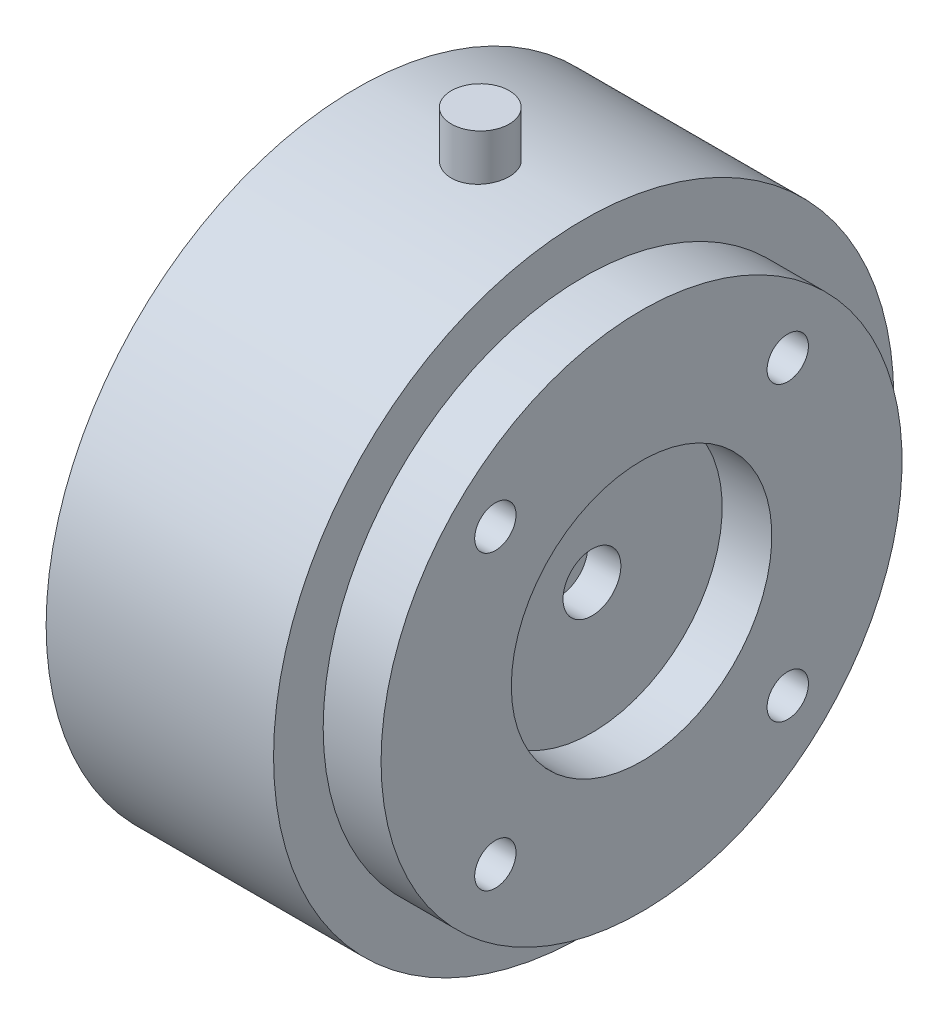
ISO-10303-21;
HEADER;
FILE_DESCRIPTION(('STEP AP214'),'2;1');
FILE_NAME('part.step','',(''),(''),'','','');
FILE_SCHEMA(('AUTOMOTIVE_DESIGN { 1 0 10303 214 1 1 1 1 }'));
ENDSEC;
DATA;
#1=APPLICATION_CONTEXT('core data for automotive mechanical design processes');
#2=APPLICATION_PROTOCOL_DEFINITION('international standard','automotive_design',2000,#1);
#3=PRODUCT_CONTEXT('',#1,'mechanical');
#4=PRODUCT('Part','Part','',(#3));
#5=PRODUCT_RELATED_PRODUCT_CATEGORY('part','',(#4));
#6=PRODUCT_DEFINITION_FORMATION('','',#4);
#7=PRODUCT_DEFINITION_CONTEXT('part definition',#1,'design');
#8=PRODUCT_DEFINITION('design','',#6,#7);
#9=PRODUCT_DEFINITION_SHAPE('','',#8);
#10=(LENGTH_UNIT() NAMED_UNIT(*) SI_UNIT(.MILLI.,.METRE.));
#11=(NAMED_UNIT(*) PLANE_ANGLE_UNIT() SI_UNIT($,.RADIAN.));
#12=(NAMED_UNIT(*) SI_UNIT($,.STERADIAN.) SOLID_ANGLE_UNIT());
#13=UNCERTAINTY_MEASURE_WITH_UNIT(LENGTH_MEASURE(1.E-05),#10,'distance_accuracy_value','');
#14=(GEOMETRIC_REPRESENTATION_CONTEXT(3) GLOBAL_UNCERTAINTY_ASSIGNED_CONTEXT((#13)) GLOBAL_UNIT_ASSIGNED_CONTEXT((#10,
#11,#12)) REPRESENTATION_CONTEXT('',''));
#15=CARTESIAN_POINT('',(0.,0.,0.));
#16=DIRECTION('',(0.,0.,1.));
#17=DIRECTION('',(1.,0.,0.));
#18=AXIS2_PLACEMENT_3D('',#15,#16,#17);
#19=CARTESIAN_POINT('',(24.5000000000001,0.,0.));
#20=DIRECTION('',(1.,0.,0.));
#21=DIRECTION('',(0.,0.,-1.));
#22=AXIS2_PLACEMENT_3D('',#19,#20,#21);
#23=PLANE('',#22);
#24=CARTESIAN_POINT('',(24.5000000000001,0.,0.));
#25=DIRECTION('',(1.,0.,0.));
#26=DIRECTION('',(0.,0.,-1.));
#27=AXIS2_PLACEMENT_3D('',#24,#25,#26);
#28=CIRCLE('',#27,3.5);
#29=CARTESIAN_POINT('',(24.5000000000001,0.,-3.50000000000006));
#30=VERTEX_POINT('',#29);
#31=EDGE_CURVE('P0_E19',#30,#30,#28,.T.);
#32=ORIENTED_EDGE('',*,*,#31,.T.);
#33=EDGE_LOOP('',(#32));
#34=FACE_BOUND('',#33,.T.);
#35=ADVANCED_FACE('P0_F16',(#34),#23,.T.);
#36=CARTESIAN_POINT('',(0.,0.,0.));
#37=DIRECTION('',(1.,0.,0.));
#38=DIRECTION('',(0.,0.,-1.));
#39=AXIS2_PLACEMENT_3D('',#36,#37,#38);
#40=CYLINDRICAL_SURFACE('',#39,3.5);
#41=CARTESIAN_POINT('',(28.5,-1.11022302462516E-13,0.));
#42=DIRECTION('',(1.,0.,0.));
#43=DIRECTION('',(0.,0.,-1.));
#44=AXIS2_PLACEMENT_3D('',#41,#42,#43);
#45=CIRCLE('',#44,3.5);
#46=CARTESIAN_POINT('',(28.5,-1.10050857315969E-13,-3.50000000000006));
#47=VERTEX_POINT('',#46);
#48=EDGE_CURVE('P0_E49',#47,#47,#45,.T.);
#49=ORIENTED_EDGE('',*,*,#48,.T.);
#50=EDGE_LOOP('',(#49));
#51=FACE_BOUND('',#50,.T.);
#52=ORIENTED_EDGE('',*,*,#31,.F.);
#53=EDGE_LOOP('',(#52));
#54=FACE_BOUND('',#53,.T.);
#55=ADVANCED_FACE('P0_F42',(#51,#54),#40,.F.);
#56=CARTESIAN_POINT('',(26.4999999999418,-17.6776695296639,17.6776695296636));
#57=DIRECTION('',(1.,0.,0.));
#58=DIRECTION('',(0.,0.,-1.));
#59=AXIS2_PLACEMENT_3D('',#56,#57,#58);
#60=CONICAL_SURFACE('',#59,2.49999999997192,1.02974425861597);
#61=CARTESIAN_POINT('',(24.9978484523581,-17.6776695296639,17.6776695297463));
#62=VERTEX_POINT('',#61);
#63=VERTEX_LOOP('',#62);
#64=FACE_BOUND('',#63,.T.);
#65=CARTESIAN_POINT('',(26.5,-17.6776695296639,17.6776695296635));
#66=DIRECTION('',(1.,0.,0.));
#67=DIRECTION('',(0.,0.,-1.));
#68=AXIS2_PLACEMENT_3D('',#65,#66,#67);
#69=CIRCLE('',#68,2.5);
#70=CARTESIAN_POINT('',(26.5,-17.6776695296639,15.1776695296635));
#71=VERTEX_POINT('',#70);
#72=EDGE_CURVE('P0_E46',#71,#71,#69,.T.);
#73=ORIENTED_EDGE('',*,*,#72,.T.);
#74=EDGE_LOOP('',(#73));
#75=FACE_BOUND('',#74,.T.);
#76=ADVANCED_FACE('P0_F38',(#64,#75),#60,.F.);
#77=CARTESIAN_POINT('',(26.4999999999418,17.6776695296637,17.6776695296638));
#78=DIRECTION('',(1.,0.,0.));
#79=DIRECTION('',(0.,0.,-1.));
#80=AXIS2_PLACEMENT_3D('',#77,#78,#79);
#81=CONICAL_SURFACE('',#80,2.49999999997201,1.029744258616);
#82=CARTESIAN_POINT('',(24.9978484523581,17.6776695296637,17.6776695297463));
#83=VERTEX_POINT('',#82);
#84=VERTEX_LOOP('',#83);
#85=FACE_BOUND('',#84,.T.);
#86=CARTESIAN_POINT('',(26.5,17.6776695296637,17.6776695296638));
#87=DIRECTION('',(1.,0.,0.));
#88=DIRECTION('',(0.,0.,-1.));
#89=AXIS2_PLACEMENT_3D('',#86,#87,#88);
#90=CIRCLE('',#89,2.5);
#91=CARTESIAN_POINT('',(26.5,17.6776695296637,15.1776695296638));
#92=VERTEX_POINT('',#91);
#93=EDGE_CURVE('P0_E48',#92,#92,#90,.T.);
#94=ORIENTED_EDGE('',*,*,#93,.T.);
#95=EDGE_LOOP('',(#94));
#96=FACE_BOUND('',#95,.T.);
#97=ADVANCED_FACE('P0_F41',(#85,#96),#81,.F.);
#98=CARTESIAN_POINT('',(26.4999999999987,17.6776695296637,-17.6776695296637));
#99=DIRECTION('',(1.,0.,0.));
#100=DIRECTION('',(0.,1.,0.));
#101=AXIS2_PLACEMENT_3D('',#98,#99,#100);
#102=CONICAL_SURFACE('',#101,2.50000000002344,1.0297442586442);
#103=CARTESIAN_POINT('',(24.9978484524149,17.6776695296637,-17.6776695296326));
#104=VERTEX_POINT('',#103);
#105=VERTEX_LOOP('',#104);
#106=FACE_BOUND('',#105,.T.);
#107=CARTESIAN_POINT('',(26.5000000000001,17.6776695296637,-17.6776695296637));
#108=DIRECTION('',(1.,0.,0.));
#109=DIRECTION('',(0.,0.,-1.));
#110=AXIS2_PLACEMENT_3D('',#107,#108,#109);
#111=CIRCLE('',#110,2.5);
#112=CARTESIAN_POINT('',(26.5000000000001,17.6776695296637,-20.1776695296637));
#113=VERTEX_POINT('',#112);
#114=EDGE_CURVE('P0_E52',#113,#113,#111,.T.);
#115=ORIENTED_EDGE('',*,*,#114,.T.);
#116=EDGE_LOOP('',(#115));
#117=FACE_BOUND('',#116,.T.);
#118=ADVANCED_FACE('P0_F140',(#106,#117),#102,.F.);
#119=CARTESIAN_POINT('',(26.4999999999985,-17.6776695296634,-17.6776695296638));
#120=DIRECTION('',(1.,0.,0.));
#121=DIRECTION('',(0.,1.,0.));
#122=AXIS2_PLACEMENT_3D('',#119,#120,#121);
#123=CONICAL_SURFACE('',#122,2.50000000002334,1.02974425864416);
#124=CARTESIAN_POINT('',(24.997848452415,-17.6776695296634,-17.6776695296326));
#125=VERTEX_POINT('',#124);
#126=VERTEX_LOOP('',#125);
#127=FACE_BOUND('',#126,.T.);
#128=CARTESIAN_POINT('',(26.4999999999999,-17.6776695296634,-17.6776695296639));
#129=DIRECTION('',(1.,0.,0.));
#130=DIRECTION('',(0.,0.,-1.));
#131=AXIS2_PLACEMENT_3D('',#128,#129,#130);
#132=CIRCLE('',#131,2.5);
#133=CARTESIAN_POINT('',(26.4999999999999,-17.6776695296634,-20.1776695296639));
#134=VERTEX_POINT('',#133);
#135=EDGE_CURVE('P0_E160',#134,#134,#132,.T.);
#136=ORIENTED_EDGE('',*,*,#135,.T.);
#137=EDGE_LOOP('',(#136));
#138=FACE_BOUND('',#137,.T.);
#139=ADVANCED_FACE('P0_F136',(#127,#138),#123,.F.);
#140=CARTESIAN_POINT('',(28.5,15.75,0.));
#141=DIRECTION('',(-1.,0.,0.));
#142=DIRECTION('',(0.,0.,1.));
#143=AXIS2_PLACEMENT_3D('',#140,#141,#142);
#144=PLANE('',#143);
#145=ORIENTED_EDGE('',*,*,#48,.F.);
#146=EDGE_LOOP('',(#145));
#147=FACE_BOUND('',#146,.T.);
#148=CARTESIAN_POINT('',(28.5,-1.11022302462516E-13,0.));
#149=DIRECTION('',(-1.,0.,0.));
#150=DIRECTION('',(0.,0.,1.));
#151=AXIS2_PLACEMENT_3D('',#148,#149,#150);
#152=CIRCLE('',#151,15.75);
#153=CARTESIAN_POINT('',(28.5,-1.15393805621977E-13,15.7499999999999));
#154=VERTEX_POINT('',#153);
#155=EDGE_CURVE('P0_E158',#154,#154,#152,.F.);
#156=ORIENTED_EDGE('',*,*,#155,.T.);
#157=EDGE_LOOP('',(#156));
#158=FACE_BOUND('',#157,.T.);
#159=ADVANCED_FACE('P0_F132',(#147,#158),#144,.F.);
#160=CARTESIAN_POINT('',(34.5000000000001,-17.6776695296638,17.6776695296635));
#161=DIRECTION('',(1.,0.,0.));
#162=DIRECTION('',(0.,0.,-1.));
#163=AXIS2_PLACEMENT_3D('',#160,#161,#162);
#164=CYLINDRICAL_SURFACE('',#163,2.5);
#165=CARTESIAN_POINT('',(34.5000000000001,-17.6776695296638,17.6776695296635));
#166=DIRECTION('',(1.,0.,0.));
#167=DIRECTION('',(0.,0.,-1.));
#168=AXIS2_PLACEMENT_3D('',#165,#166,#167);
#169=CIRCLE('',#168,2.5);
#170=CARTESIAN_POINT('',(34.5000000000001,-17.6776695296638,15.1776695296635));
#171=VERTEX_POINT('',#170);
#172=EDGE_CURVE('P0_E159',#171,#171,#169,.T.);
#173=ORIENTED_EDGE('',*,*,#172,.T.);
#174=EDGE_LOOP('',(#173));
#175=FACE_BOUND('',#174,.T.);
#176=ORIENTED_EDGE('',*,*,#72,.F.);
#177=EDGE_LOOP('',(#176));
#178=FACE_BOUND('',#177,.T.);
#179=ADVANCED_FACE('P0_F128',(#175,#178),#164,.F.);
#180=CARTESIAN_POINT('',(34.5,17.6776695296637,17.6776695296636));
#181=DIRECTION('',(1.,0.,0.));
#182=DIRECTION('',(0.,0.,-1.));
#183=AXIS2_PLACEMENT_3D('',#180,#181,#182);
#184=CYLINDRICAL_SURFACE('',#183,2.5);
#185=CARTESIAN_POINT('',(34.5,17.6776695296637,17.6776695296636));
#186=DIRECTION('',(1.,0.,0.));
#187=DIRECTION('',(0.,0.,-1.));
#188=AXIS2_PLACEMENT_3D('',#185,#186,#187);
#189=CIRCLE('',#188,2.5);
#190=CARTESIAN_POINT('',(34.5,17.6776695296637,15.1776695296636));
#191=VERTEX_POINT('',#190);
#192=EDGE_CURVE('P0_E163',#191,#191,#189,.T.);
#193=ORIENTED_EDGE('',*,*,#192,.T.);
#194=EDGE_LOOP('',(#193));
#195=FACE_BOUND('',#194,.T.);
#196=ORIENTED_EDGE('',*,*,#93,.F.);
#197=EDGE_LOOP('',(#196));
#198=FACE_BOUND('',#197,.T.);
#199=ADVANCED_FACE('P0_F124',(#195,#198),#184,.F.);
#200=CARTESIAN_POINT('',(34.5,17.6776695296638,-17.6776695296637));
#201=DIRECTION('',(1.,0.,0.));
#202=DIRECTION('',(0.,0.,-1.));
#203=AXIS2_PLACEMENT_3D('',#200,#201,#202);
#204=CYLINDRICAL_SURFACE('',#203,2.5);
#205=CARTESIAN_POINT('',(34.5,17.6776695296638,-17.6776695296637));
#206=DIRECTION('',(1.,0.,0.));
#207=DIRECTION('',(0.,0.,-1.));
#208=AXIS2_PLACEMENT_3D('',#205,#206,#207);
#209=CIRCLE('',#208,2.5);
#210=CARTESIAN_POINT('',(34.5,17.6776695296638,-20.1776695296637));
#211=VERTEX_POINT('',#210);
#212=EDGE_CURVE('P0_E170',#211,#211,#209,.T.);
#213=ORIENTED_EDGE('',*,*,#212,.T.);
#214=EDGE_LOOP('',(#213));
#215=FACE_BOUND('',#214,.T.);
#216=ORIENTED_EDGE('',*,*,#114,.F.);
#217=EDGE_LOOP('',(#216));
#218=FACE_BOUND('',#217,.T.);
#219=ADVANCED_FACE('P0_F120',(#215,#218),#204,.F.);
#220=CARTESIAN_POINT('',(34.5,-17.6776695296637,-17.6776695296638));
#221=DIRECTION('',(1.,0.,0.));
#222=DIRECTION('',(0.,0.,-1.));
#223=AXIS2_PLACEMENT_3D('',#220,#221,#222);
#224=CYLINDRICAL_SURFACE('',#223,2.5);
#225=CARTESIAN_POINT('',(34.5,-17.6776695296637,-17.6776695296638));
#226=DIRECTION('',(1.,0.,0.));
#227=DIRECTION('',(0.,0.,-1.));
#228=AXIS2_PLACEMENT_3D('',#225,#226,#227);
#229=CIRCLE('',#228,2.5);
#230=CARTESIAN_POINT('',(34.5,-17.6776695296637,-20.1776695296638));
#231=VERTEX_POINT('',#230);
#232=EDGE_CURVE('P0_E173',#231,#231,#229,.T.);
#233=ORIENTED_EDGE('',*,*,#232,.T.);
#234=EDGE_LOOP('',(#233));
#235=FACE_BOUND('',#234,.T.);
#236=ORIENTED_EDGE('',*,*,#135,.F.);
#237=EDGE_LOOP('',(#236));
#238=FACE_BOUND('',#237,.T.);
#239=ADVANCED_FACE('P0_F116',(#235,#238),#224,.F.);
#240=CARTESIAN_POINT('',(0.,0.,0.));
#241=DIRECTION('',(-1.,0.,0.));
#242=DIRECTION('',(0.,0.,1.));
#243=AXIS2_PLACEMENT_3D('',#240,#241,#242);
#244=CYLINDRICAL_SURFACE('',#243,15.75);
#245=ORIENTED_EDGE('',*,*,#155,.F.);
#246=EDGE_LOOP('',(#245));
#247=FACE_BOUND('',#246,.T.);
#248=CARTESIAN_POINT('',(34.5,0.,1.11022302462516E-13));
#249=DIRECTION('',(-1.,0.,0.));
#250=DIRECTION('',(0.,0.,1.));
#251=AXIS2_PLACEMENT_3D('',#248,#249,#250);
#252=CIRCLE('',#251,15.75);
#253=CARTESIAN_POINT('',(34.5,0.,15.7500000000001));
#254=VERTEX_POINT('',#253);
#255=EDGE_CURVE('P0_E176',#254,#254,#252,.F.);
#256=ORIENTED_EDGE('',*,*,#255,.T.);
#257=EDGE_LOOP('',(#256));
#258=FACE_BOUND('',#257,.T.);
#259=ADVANCED_FACE('P0_F112',(#247,#258),#244,.F.);
#260=CARTESIAN_POINT('',(34.5000000000001,31.5,0.));
#261=DIRECTION('',(-1.,0.,0.));
#262=DIRECTION('',(0.,0.,1.));
#263=AXIS2_PLACEMENT_3D('',#260,#261,#262);
#264=PLANE('',#263);
#265=ORIENTED_EDGE('',*,*,#255,.F.);
#266=EDGE_LOOP('',(#265));
#267=FACE_BOUND('',#266,.T.);
#268=ORIENTED_EDGE('',*,*,#232,.F.);
#269=EDGE_LOOP('',(#268));
#270=FACE_BOUND('',#269,.T.);
#271=ORIENTED_EDGE('',*,*,#212,.F.);
#272=EDGE_LOOP('',(#271));
#273=FACE_BOUND('',#272,.T.);
#274=ORIENTED_EDGE('',*,*,#192,.F.);
#275=EDGE_LOOP('',(#274));
#276=FACE_BOUND('',#275,.T.);
#277=ORIENTED_EDGE('',*,*,#172,.F.);
#278=EDGE_LOOP('',(#277));
#279=FACE_BOUND('',#278,.T.);
#280=CARTESIAN_POINT('',(34.5,0.,1.11022302462516E-13));
#281=DIRECTION('',(-1.,0.,0.));
#282=DIRECTION('',(0.,0.,1.));
#283=AXIS2_PLACEMENT_3D('',#280,#281,#282);
#284=CIRCLE('',#283,31.5);
#285=CARTESIAN_POINT('',(34.5,0.,31.5000000000001));
#286=VERTEX_POINT('',#285);
#287=EDGE_CURVE('P0_E178',#286,#286,#284,.T.);
#288=ORIENTED_EDGE('',*,*,#287,.F.);
#289=EDGE_LOOP('',(#288));
#290=FACE_BOUND('',#289,.T.);
#291=ADVANCED_FACE('P0_F108',(#267,#270,#273,#276,#279,#290),#264,.F.);
#292=CARTESIAN_POINT('',(0.,0.,0.));
#293=DIRECTION('',(-1.,0.,0.));
#294=DIRECTION('',(0.,0.,1.));
#295=AXIS2_PLACEMENT_3D('',#292,#293,#294);
#296=CYLINDRICAL_SURFACE('',#295,31.5);
#297=CARTESIAN_POINT('',(27.4999999999999,0.,0.));
#298=DIRECTION('',(-1.,0.,0.));
#299=DIRECTION('',(0.,0.,1.));
#300=AXIS2_PLACEMENT_3D('',#297,#298,#299);
#301=CIRCLE('',#300,31.5);
#302=CARTESIAN_POINT('',(27.4999999999999,0.,31.5));
#303=VERTEX_POINT('',#302);
#304=EDGE_CURVE('P0_E90',#303,#303,#301,.F.);
#305=ORIENTED_EDGE('',*,*,#304,.T.);
#306=EDGE_LOOP('',(#305));
#307=FACE_BOUND('',#306,.T.);
#308=ORIENTED_EDGE('',*,*,#287,.T.);
#309=EDGE_LOOP('',(#308));
#310=FACE_BOUND('',#309,.T.);
#311=ADVANCED_FACE('P0_F104',(#307,#310),#296,.T.);
#312=CARTESIAN_POINT('',(110.767027304759,0.,0.));
#313=DIRECTION('',(-1.,0.,0.));
#314=DIRECTION('',(0.,0.,1.));
#315=AXIS2_PLACEMENT_3D('',#312,#313,#314);
#316=CYLINDRICAL_SURFACE('',#315,30.5);
#317=CARTESIAN_POINT('',(14.9999999999999,30.2985148150862,3.5));
#318=CARTESIAN_POINT('',(15.1957241918326,30.2985173782008,3.4999914572695));
#319=CARTESIAN_POINT('',(15.391706129943,30.3004332540409,3.48351415691749));
#320=CARTESIAN_POINT('',(15.7783592301681,30.3078916885357,3.41800360986971));
#321=CARTESIAN_POINT('',(15.9690184270781,30.313441824264,3.36890234227045));
#322=CARTESIAN_POINT('',(16.3391717964098,30.3275322944482,3.23959657868737));
#323=CARTESIAN_POINT('',(16.5186773197242,30.3360695282893,3.15942432520612));
#324=CARTESIAN_POINT('',(16.8616010791099,30.3551677477308,2.97031612135546));
#325=CARTESIAN_POINT('',(17.0250261007646,30.3657278741279,2.86139237549712));
#326=CARTESIAN_POINT('',(17.3320316611393,30.3877407639859,2.61729800992376));
#327=CARTESIAN_POINT('',(17.4755233500653,30.3991971892655,2.48201595110771));
#328=CARTESIAN_POINT('',(17.737825696396,30.4216792291987,2.18927848624546));
#329=CARTESIAN_POINT('',(17.8566339511489,30.4327048018289,2.03182092416667));
#330=CARTESIAN_POINT('',(18.066493529691,30.4531181691266,1.69866981088559));
#331=CARTESIAN_POINT('',(18.1574674419036,30.4625013656716,1.5229271905094));
#332=CARTESIAN_POINT('',(18.3085792035096,30.4785337357317,1.15853524249232));
#333=CARTESIAN_POINT('',(18.3687182945705,30.4851830193348,0.969886434909154));
#334=CARTESIAN_POINT('',(18.4561968809371,30.4949733208849,0.585919982397254));
#335=CARTESIAN_POINT('',(18.4836801096441,30.4981297084171,0.390635482220859));
#336=CARTESIAN_POINT('',(18.5055119415604,30.5006309800531,-0.00179814922140255));
#337=CARTESIAN_POINT('',(18.4998615965257,30.4999759851413,-0.19894722110201));
#338=CARTESIAN_POINT('',(18.4557026022766,30.4949407964534,-0.588534530467312));
#339=CARTESIAN_POINT('',(18.4173488190872,30.4905781604075,-0.78099058050521));
#340=CARTESIAN_POINT('',(18.3091128024471,30.4786377272088,-1.15671787386293));
#341=CARTESIAN_POINT('',(18.2392297691636,30.4710598484922,-1.33998888404595));
#342=CARTESIAN_POINT('',(18.0697493194626,30.4535100495338,-1.69263095242612));
#343=CARTESIAN_POINT('',(17.9700832237732,30.4435326064287,-1.86196871705051));
#344=CARTESIAN_POINT('',(17.743924441584,30.42230250347,-2.18155900020489));
#345=CARTESIAN_POINT('',(17.6174329078277,30.4110498984223,-2.33181233838793));
#346=CARTESIAN_POINT('',(17.3403704070087,30.3884551454815,-2.60986627331936));
#347=CARTESIAN_POINT('',(17.1896691856528,30.3771128480346,-2.73753708685227));
#348=CARTESIAN_POINT('',(16.8688244322087,30.3556737708395,-2.96585046369162));
#349=CARTESIAN_POINT('',(16.6986719939111,30.3455775660805,-3.0664805745327));
#350=CARTESIAN_POINT('',(16.343601570948,30.3277726662425,-3.2378490224737));
#351=CARTESIAN_POINT('',(16.1586669763758,30.3200667057629,-3.30855315570518));
#352=CARTESIAN_POINT('',(15.7796931406874,30.3079568417157,-3.41772073943077));
#353=CARTESIAN_POINT('',(15.5856741279068,30.3035459409149,-3.45625253020598));
#354=CARTESIAN_POINT('',(15.3252842170864,30.3001908899848,-3.48546347914358));
#355=CARTESIAN_POINT('',(15.2603563162059,30.2995636448211,-3.49091060261984));
#356=CARTESIAN_POINT('',(15.1302951331559,30.2987251806387,-3.49818028569423));
#357=CARTESIAN_POINT('',(15.0651618509191,30.2985139617564,-3.50000284410502));
#358=CARTESIAN_POINT('',(14.8042758081673,30.2985173782011,-3.49999145726934));
#359=CARTESIAN_POINT('',(14.608293870057,30.3004332540409,-3.4835141569176));
#360=CARTESIAN_POINT('',(14.2216407698319,30.3078916885356,-3.41800360986996));
#361=CARTESIAN_POINT('',(14.030981572922,30.313441824264,-3.36890234227058));
#362=CARTESIAN_POINT('',(13.6608282035903,30.3275322944482,-3.23959657868745));
#363=CARTESIAN_POINT('',(13.4813226802759,30.3360695282893,-3.15942432520628));
#364=CARTESIAN_POINT('',(13.1383989208902,30.3551677477307,-2.97031612135555));
#365=CARTESIAN_POINT('',(12.9749738992356,30.3657278741277,-2.86139237549705));
#366=CARTESIAN_POINT('',(12.6679683388608,30.3877407639858,-2.6172980099236));
#367=CARTESIAN_POINT('',(12.5244766499348,30.3991971892655,-2.48201595110762));
#368=CARTESIAN_POINT('',(12.262174303604,30.4216792291987,-2.18927848624544));
#369=CARTESIAN_POINT('',(12.143366048851,30.4327048018288,-2.03182092416665));
#370=CARTESIAN_POINT('',(11.933506470309,30.4531181691265,-1.69866981088553));
#371=CARTESIAN_POINT('',(11.8425325580965,30.4625013656716,-1.5229271905093));
#372=CARTESIAN_POINT('',(11.6914207964905,30.4785337357317,-1.15853524249226));
#373=CARTESIAN_POINT('',(11.6312817054294,30.4851830193349,-0.969886434909178));
#374=CARTESIAN_POINT('',(11.5438031190628,30.494973320885,-0.585919982397338));
#375=CARTESIAN_POINT('',(11.5163198903561,30.4981297084171,-0.390635482220923));
#376=CARTESIAN_POINT('',(11.4944880584398,30.5006309800531,0.00179814922135011));
#377=CARTESIAN_POINT('',(11.5001384034742,30.4999759851413,0.19894722110195));
#378=CARTESIAN_POINT('',(11.5442973977233,30.4949407964534,0.588534530467167));
#379=CARTESIAN_POINT('',(11.582651180913,30.4905781604075,0.780990580504988));
#380=CARTESIAN_POINT('',(11.6908871975531,30.4786377272088,1.15671787386277));
#381=CARTESIAN_POINT('',(11.7607702308363,30.4710598484922,1.33998888404593));
#382=CARTESIAN_POINT('',(11.9302506805373,30.4535100495338,1.69263095242604));
#383=CARTESIAN_POINT('',(12.0299167762271,30.4435326064287,1.86196871705023));
#384=CARTESIAN_POINT('',(12.2560755584162,30.42230250347,2.18155900020472));
#385=CARTESIAN_POINT('',(12.3825670921721,30.4110498984223,2.33181233838806));
#386=CARTESIAN_POINT('',(12.6596295929911,30.3884551454815,2.60986627331947));
#387=CARTESIAN_POINT('',(12.8103308143472,30.3771128480346,2.73753708685206));
#388=CARTESIAN_POINT('',(13.1311755677915,30.3556737708395,2.96585046369126));
#389=CARTESIAN_POINT('',(13.301328006089,30.3455775660803,3.06648057453252));
#390=CARTESIAN_POINT('',(13.6563984290521,30.3277726662424,3.23784902247352));
#391=CARTESIAN_POINT('',(13.8413330236244,30.320066705763,3.30855315570481));
#392=CARTESIAN_POINT('',(14.2203068593126,30.3079568417157,3.41772073943061));
#393=CARTESIAN_POINT('',(14.4143258720932,30.3035459409146,3.45625253020622));
#394=CARTESIAN_POINT('',(14.6747157829135,30.3001908899848,3.4854634791435));
#395=CARTESIAN_POINT('',(14.739643683794,30.2995636448211,3.49091060261961));
#396=CARTESIAN_POINT('',(14.869704866844,30.2987251806388,3.49818028569398));
#397=CARTESIAN_POINT('',(14.9348381490808,30.2985139617563,3.5000028441049));
#398=CARTESIAN_POINT('',(14.9999999999999,30.2985148150862,3.5));
#399=B_SPLINE_CURVE_WITH_KNOTS('',3,(#317,#318,#319,#320,#321,#322,#323,#324,#325,#326,#327,
#328,#329,#330,#331,#332,#333,#334,#335,#336,#337,#338,#339,#340,#341,#342,#343,#344,#345,#346,
#347,#348,#349,#350,#351,#352,#353,#354,#355,#356,#357,#358,#359,#360,#361,#362,#363,#364,#365,
#366,#367,#368,#369,#370,#371,#372,#373,#374,#375,#376,#377,#378,#379,#380,#381,#382,#383,#384,
#385,#386,#387,#388,#389,#390,#391,#392,#393,#394,#395,#396,#397,#398),.UNSPECIFIED.,.T.,.F.,(4,
2,2,2,2,2,2,2,2,2,2,2,2,2,2,2,2,2,2,2,2,2,2,2,2,2,2,2,2,2,2,2,2,2,2,2,2,2,2,2,4),(0.,
0.586924300188952,1.17507619265096,1.76261938441868,2.34991357422272,2.93974685655122,
3.5296375255741,4.12115416296202,4.71264697907618,5.30152660512314,5.89038753852038,
6.47647532939791,7.06257798896412,7.65004276072656,8.23748229304974,8.82819532080976,
9.41917991237913,10.0108381570742,10.6012363845079,10.7966392157226,10.9920421109477,
11.5789664111365,12.1671183035984,12.7546614953662,13.3419556851703,13.9317889674988,
14.5216796365218,15.1131962739096,15.7046890900237,16.2935687160706,16.8824296494678,
17.4685174403453,18.0546200999115,18.642084871674,19.2295244039972,19.8202374317572,
20.4112220233266,21.0028802680216,21.5932784954552,21.7886813266699,21.9840842218949),.UNSPECIFIED.);
#400=CARTESIAN_POINT('',(14.9999999999999,30.2985148150862,3.5));
#401=VERTEX_POINT('',#400);
#402=EDGE_CURVE('P0_E88',#401,#401,#399,.T.);
#403=ORIENTED_EDGE('',*,*,#402,.T.);
#404=EDGE_LOOP('',(#403));
#405=FACE_BOUND('',#404,.T.);
#406=ADVANCED_FACE('P0_F98',(#405),#316,.T.);
#407=CARTESIAN_POINT('',(27.5,37.5,0.));
#408=DIRECTION('',(-1.,0.,0.));
#409=DIRECTION('',(0.,0.,1.));
#410=AXIS2_PLACEMENT_3D('',#407,#408,#409);
#411=PLANE('',#410);
#412=ORIENTED_EDGE('',*,*,#304,.F.);
#413=EDGE_LOOP('',(#412));
#414=FACE_BOUND('',#413,.T.);
#415=CARTESIAN_POINT('',(27.4999999999999,0.,0.));
#416=DIRECTION('',(-1.,0.,0.));
#417=DIRECTION('',(0.,0.,1.));
#418=AXIS2_PLACEMENT_3D('',#415,#416,#417);
#419=CIRCLE('',#418,37.5);
#420=CARTESIAN_POINT('',(27.4999999999999,0.,37.5));
#421=VERTEX_POINT('',#420);
#422=EDGE_CURVE('P0_E86',#421,#421,#419,.T.);
#423=ORIENTED_EDGE('',*,*,#422,.F.);
#424=EDGE_LOOP('',(#423));
#425=FACE_BOUND('',#424,.T.);
#426=ADVANCED_FACE('P0_F103',(#414,#425),#411,.F.);
#427=CARTESIAN_POINT('',(-1.11022302462516E-13,37.5000000000001,0.));
#428=DIRECTION('',(1.,0.,0.));
#429=DIRECTION('',(0.,0.,-1.));
#430=AXIS2_PLACEMENT_3D('',#427,#428,#429);
#431=PLANE('',#430);
#432=CARTESIAN_POINT('',(0.,0.,0.));
#433=DIRECTION('',(-1.,0.,0.));
#434=DIRECTION('',(0.,0.,1.));
#435=AXIS2_PLACEMENT_3D('',#432,#433,#434);
#436=CIRCLE('',#435,37.5);
#437=CARTESIAN_POINT('',(0.,0.,37.5));
#438=VERTEX_POINT('',#437);
#439=EDGE_CURVE('P0_E25',#438,#438,#436,.F.);
#440=ORIENTED_EDGE('',*,*,#439,.F.);
#441=EDGE_LOOP('',(#440));
#442=FACE_BOUND('',#441,.T.);
#443=ADVANCED_FACE('P0_F77',(#442),#431,.F.);
#444=CARTESIAN_POINT('',(15.0000000000001,37.5000000000001,-1.11022302462516E-13));
#445=DIRECTION('',(0.,-1.,0.));
#446=DIRECTION('',(0.,0.,-1.));
#447=AXIS2_PLACEMENT_3D('',#444,#445,#446);
#448=CYLINDRICAL_SURFACE('',#447,3.5);
#449=ORIENTED_EDGE('',*,*,#402,.F.);
#450=EDGE_LOOP('',(#449));
#451=FACE_BOUND('',#450,.T.);
#452=CARTESIAN_POINT('',(15.,37.3363094051888,3.5));
#453=CARTESIAN_POINT('',(14.8040356546836,37.3363114581778,3.49999159976158));
#454=CARTESIAN_POINT('',(14.6078108510814,37.3378699743436,3.48347414309534));
#455=CARTESIAN_POINT('',(14.2206662319479,37.3439381541416,3.41779635529475));
#456=CARTESIAN_POINT('',(14.029758477096,37.3484540346556,3.36856725553225));
#457=CARTESIAN_POINT('',(13.6591047581184,37.3599213532937,3.23890177151366));
#458=CARTESIAN_POINT('',(13.4793481849901,37.3668704333545,3.15849559352653));
#459=CARTESIAN_POINT('',(13.135970562157,37.3824176383386,2.96881481261254));
#460=CARTESIAN_POINT('',(12.9723424418787,37.3910150357417,2.8595529377632));
#461=CARTESIAN_POINT('',(12.6652349406536,37.4089230033886,2.61486659417057));
#462=CARTESIAN_POINT('',(12.5218158616422,37.4182355850682,2.47936657463346));
#463=CARTESIAN_POINT('',(12.2597132336003,37.4365066736323,2.1862053535237));
#464=CARTESIAN_POINT('',(12.1410319960815,37.4454651473655,2.02854208331274));
#465=CARTESIAN_POINT('',(11.9315855414435,37.4620368979856,1.69518417705761));
#466=CARTESIAN_POINT('',(11.8408710104557,37.4696477219284,1.51945756287204));
#467=CARTESIAN_POINT('',(11.6902584131927,37.482645682227,1.15518511728842));
#468=CARTESIAN_POINT('',(11.6303594163984,37.4880328857272,0.966639673167948));
#469=CARTESIAN_POINT('',(11.5432468661134,37.4959630819517,0.58266634826372));
#470=CARTESIAN_POINT('',(11.5159380514923,37.4985143625747,0.387260253394434));
#471=CARTESIAN_POINT('',(11.4944864434939,37.5005134027287,-0.00537773248793382));
#472=CARTESIAN_POINT('',(11.5003429514608,37.4999612276368,-0.202609584952487));
#473=CARTESIAN_POINT('',(11.5449780751454,37.4958223841302,-0.592651845396382));
#474=CARTESIAN_POINT('',(11.5836539539395,37.4922451852938,-0.785474124760546));
#475=CARTESIAN_POINT('',(11.6926706451642,37.4824692916634,-1.16188026092169));
#476=CARTESIAN_POINT('',(11.7630121132134,37.4762705425918,-1.34546392635079));
#477=CARTESIAN_POINT('',(11.933479471107,37.4619321209238,-1.6985107371526));
#478=CARTESIAN_POINT('',(12.0336520733446,37.4537894082822,-1.8679511990282));
#479=CARTESIAN_POINT('',(12.2608953181714,37.4364782470949,-2.18763883602483));
#480=CARTESIAN_POINT('',(12.387964414117,37.4273098575436,-2.33788711396818));
#481=CARTESIAN_POINT('',(12.6659461822892,37.4089367108281,-2.61551577028365));
#482=CARTESIAN_POINT('',(12.816943545917,37.3997319422154,-2.7428113531978));
#483=CARTESIAN_POINT('',(13.1382924676749,37.3823522474712,-2.9703212631776));
#484=CARTESIAN_POINT('',(13.3086529719222,37.3741778010753,-3.07052299956899));
#485=CARTESIAN_POINT('',(13.663999121344,37.3597825872581,-3.24098749669502));
#486=CARTESIAN_POINT('',(13.8489991360946,37.3535637699405,-3.31122039801263));
#487=CARTESIAN_POINT('',(14.2279833006619,37.3438123278044,-3.419455935303));
#488=CARTESIAN_POINT('',(14.4219474524402,37.3402740034855,-3.45752697663096));
#489=CARTESIAN_POINT('',(14.6809971292402,37.3376175073627,-3.48602054515325));
#490=CARTESIAN_POINT('',(14.7446764902426,37.3371279469485,-3.49125901470405));
#491=CARTESIAN_POINT('',(14.872228002849,37.3364735611131,-3.4982501120222));
#492=CARTESIAN_POINT('',(14.9361001544887,37.3363087357524,-3.50000273914094));
#493=CARTESIAN_POINT('',(15.1959643453164,37.3363114581778,-3.49999159976145));
#494=CARTESIAN_POINT('',(15.3921891489186,37.3378699743436,-3.48347414309553));
#495=CARTESIAN_POINT('',(15.7793337680521,37.3439381541415,-3.41779635529509));
#496=CARTESIAN_POINT('',(15.9702415229039,37.3484540346556,-3.36856725553241));
#497=CARTESIAN_POINT('',(16.3408952418815,37.3599213532937,-3.23890177151383));
#498=CARTESIAN_POINT('',(16.5206518150099,37.3668704333545,-3.15849559352687));
#499=CARTESIAN_POINT('',(16.864029437843,37.3824176383385,-2.9688148126129));
#500=CARTESIAN_POINT('',(17.0276575581211,37.3910150357416,-2.8595529377634));
#501=CARTESIAN_POINT('',(17.3347650593464,37.4089230033884,-2.61486659417077));
#502=CARTESIAN_POINT('',(17.478184138358,37.4182355850681,-2.47936657463382));
#503=CARTESIAN_POINT('',(17.7402867663998,37.4365066736323,-2.18620535352393));
#504=CARTESIAN_POINT('',(17.8589680039184,37.4454651473656,-2.0285420833127));
#505=CARTESIAN_POINT('',(18.0684144585564,37.4620368979857,-1.69518417705746));
#506=CARTESIAN_POINT('',(18.1591289895446,37.4696477219284,-1.51945756287207));
#507=CARTESIAN_POINT('',(18.3097415868076,37.482645682227,-1.15518511728853));
#508=CARTESIAN_POINT('',(18.3696405836016,37.4880328857273,-0.966639673167969));
#509=CARTESIAN_POINT('',(18.4567531338866,37.4959630819518,-0.582666348263707));
#510=CARTESIAN_POINT('',(18.484061948508,37.4985143625747,-0.387260253394477));
#511=CARTESIAN_POINT('',(18.5055135565063,37.5005134027287,0.00537773248781911));
#512=CARTESIAN_POINT('',(18.499657048539,37.4999612276367,0.202609584952356));
#513=CARTESIAN_POINT('',(18.4550219248544,37.4958223841303,0.592651845396319));
#514=CARTESIAN_POINT('',(18.4163460460606,37.4922451852938,0.785474124760568));
#515=CARTESIAN_POINT('',(18.307329354836,37.4824692916633,1.16188026092174));
#516=CARTESIAN_POINT('',(18.2369878867866,37.4762705425917,1.34546392635078));
#517=CARTESIAN_POINT('',(18.0665205288928,37.4619321209237,1.69851073715259));
#518=CARTESIAN_POINT('',(17.9663479266554,37.4537894082822,1.86795119902825));
#519=CARTESIAN_POINT('',(17.7391046818287,37.4364782470949,2.18763883602493));
#520=CARTESIAN_POINT('',(17.6120355858831,37.4273098575436,2.33788711396826));
#521=CARTESIAN_POINT('',(17.3340538177108,37.4089367108281,2.61551577028367));
#522=CARTESIAN_POINT('',(17.183056454083,37.3997319422155,2.74281135319776));
#523=CARTESIAN_POINT('',(16.8617075323251,37.3823522474712,2.97032126317755));
#524=CARTESIAN_POINT('',(16.6913470280778,37.3741778010751,3.07052299956898));
#525=CARTESIAN_POINT('',(16.336000878656,37.359782587258,3.24098749669492));
#526=CARTESIAN_POINT('',(16.1510008639054,37.3535637699405,3.31122039801238));
#527=CARTESIAN_POINT('',(15.7720166993381,37.3438123278045,3.41945593530296));
#528=CARTESIAN_POINT('',(15.5780525475599,37.3402740034854,3.45752697663129));
#529=CARTESIAN_POINT('',(15.3190028707598,37.3376175073627,3.48602054515322));
#530=CARTESIAN_POINT('',(15.2553235097574,37.3371279469485,3.49125901470386));
#531=CARTESIAN_POINT('',(15.1277719971511,37.3364735611131,3.49825011202197));
#532=CARTESIAN_POINT('',(15.0638998455113,37.3363087357524,3.50000273914082));
#533=CARTESIAN_POINT('',(15.,37.3363094051888,3.5));
#534=B_SPLINE_CURVE_WITH_KNOTS('',3,(#452,#453,#454,#455,#456,#457,#458,#459,#460,#461,#462,
#463,#464,#465,#466,#467,#468,#469,#470,#471,#472,#473,#474,#475,#476,#477,#478,#479,#480,#481,
#482,#483,#484,#485,#486,#487,#488,#489,#490,#491,#492,#493,#494,#495,#496,#497,#498,#499,#500,
#501,#502,#503,#504,#505,#506,#507,#508,#509,#510,#511,#512,#513,#514,#515,#516,#517,#518,#519,
#520,#521,#522,#523,#524,#525,#526,#527,#528,#529,#530,#531,#532,#533),.UNSPECIFIED.,.T.,.F.,(4,
2,2,2,2,2,2,2,2,2,2,2,2,2,2,2,2,2,2,2,2,2,2,2,2,2,2,2,2,2,2,2,2,2,2,2,2,2,2,2,4),(0.,
0.58764972414886,1.17653877041984,1.76485868472888,2.35291952676923,2.94269952541398,
3.53253460860331,4.1234324930425,4.71431253342707,5.30346116721971,5.89259739013856,
6.47989617052845,7.06720711117341,7.65544259808858,8.24364426856428,8.83397632780442,
9.42458224827785,10.0157752520498,10.6057076533399,10.7973278153647,10.9889480130451,
11.5765977371939,12.1654867834649,12.7538066977739,13.3418675398143,13.9316475384591,
14.5214826216487,15.1123805060879,15.7032605464724,16.292409180265,16.8815454031838,
17.4688441835738,18.0561551242188,18.644390611134,19.2325922816097,19.8229243408498,
20.4135302613232,21.0047232650952,21.5946556663852,21.78627582841,21.9778960260904),.UNSPECIFIED.);
#535=CARTESIAN_POINT('',(15.,37.3363094051888,3.5));
#536=VERTEX_POINT('',#535);
#537=EDGE_CURVE('P0_E11',#536,#536,#534,.T.);
#538=ORIENTED_EDGE('',*,*,#537,.F.);
#539=EDGE_LOOP('',(#538));
#540=FACE_BOUND('',#539,.T.);
#541=ADVANCED_FACE('P0_F66',(#451,#540),#448,.F.);
#542=CARTESIAN_POINT('',(0.,0.,0.));
#543=DIRECTION('',(-1.,0.,0.));
#544=DIRECTION('',(0.,0.,1.));
#545=AXIS2_PLACEMENT_3D('',#542,#543,#544);
#546=CYLINDRICAL_SURFACE('',#545,37.5);
#547=ORIENTED_EDGE('',*,*,#537,.T.);
#548=EDGE_LOOP('',(#547));
#549=FACE_BOUND('',#548,.T.);
#550=ORIENTED_EDGE('',*,*,#439,.T.);
#551=EDGE_LOOP('',(#550));
#552=FACE_BOUND('',#551,.T.);
#553=ORIENTED_EDGE('',*,*,#422,.T.);
#554=EDGE_LOOP('',(#553));
#555=FACE_BOUND('',#554,.T.);
#556=ADVANCED_FACE('P0_F69',(#549,#552,#555),#546,.T.);
#557=CLOSED_SHELL('',(#35,#55,#76,#97,#118,#139,#159,#179,#199,#219,#239,#259,#291,#311,#406,
#426,#443,#541,#556));
#558=MANIFOLD_SOLID_BREP('P0_B1',#557);
#559=CARTESIAN_POINT('',(33.0000000001291,10.9999999999998,19.0525588832577));
#560=DIRECTION('',(-1.,0.,0.));
#561=DIRECTION('',(0.,0.,1.));
#562=AXIS2_PLACEMENT_3D('',#559,#560,#561);
#563=CONICAL_SURFACE('',#562,1.24999999994418,1.02974425845604);
#564=CARTESIAN_POINT('',(33.751075773921,10.9999999999997,19.052558883061));
#565=VERTEX_POINT('',#564);
#566=VERTEX_LOOP('',#565);
#567=FACE_BOUND('',#566,.T.);
#568=CARTESIAN_POINT('',(33.,10.9999999999998,19.0525588832578));
#569=DIRECTION('',(-1.,0.,0.));
#570=DIRECTION('',(0.,0.,1.));
#571=AXIS2_PLACEMENT_3D('',#568,#569,#570);
#572=CIRCLE('',#571,1.25);
#573=CARTESIAN_POINT('',(33.,10.9999999999998,20.3025588832578));
#574=VERTEX_POINT('',#573);
#575=EDGE_CURVE('P1_E22',#574,#574,#572,.T.);
#576=ORIENTED_EDGE('',*,*,#575,.F.);
#577=EDGE_LOOP('',(#576));
#578=FACE_BOUND('',#577,.T.);
#579=ADVANCED_FACE('P1_F16',(#567,#578),#563,.T.);
#580=CARTESIAN_POINT('',(24.5000000000001,0.,0.));
#581=DIRECTION('',(1.,0.,0.));
#582=DIRECTION('',(0.,0.,-1.));
#583=AXIS2_PLACEMENT_3D('',#580,#581,#582);
#584=PLANE('',#583);
#585=CARTESIAN_POINT('',(24.5,10.9999999999998,19.0525588832577));
#586=DIRECTION('',(-1.,0.,0.));
#587=DIRECTION('',(0.,0.,1.));
#588=AXIS2_PLACEMENT_3D('',#585,#586,#587);
#589=CIRCLE('',#588,1.25);
#590=CARTESIAN_POINT('',(24.5,10.9999999999998,20.3025588832577));
#591=VERTEX_POINT('',#590);
#592=EDGE_CURVE('P1_E11',#591,#591,#589,.F.);
#593=ORIENTED_EDGE('',*,*,#592,.F.);
#594=EDGE_LOOP('',(#593));
#595=FACE_BOUND('',#594,.T.);
#596=ADVANCED_FACE('P1_F27',(#595),#584,.F.);
#597=CARTESIAN_POINT('',(24.5,10.9999999999998,19.0525588832577));
#598=DIRECTION('',(-1.,0.,0.));
#599=DIRECTION('',(0.,0.,1.));
#600=AXIS2_PLACEMENT_3D('',#597,#598,#599);
#601=CYLINDRICAL_SURFACE('',#600,1.25);
#602=ORIENTED_EDGE('',*,*,#592,.T.);
#603=EDGE_LOOP('',(#602));
#604=FACE_BOUND('',#603,.T.);
#605=ORIENTED_EDGE('',*,*,#575,.T.);
#606=EDGE_LOOP('',(#605));
#607=FACE_BOUND('',#606,.T.);
#608=ADVANCED_FACE('P1_F33',(#604,#607),#601,.T.);
#609=CLOSED_SHELL('',(#579,#596,#608));
#610=MANIFOLD_SOLID_BREP('P1_B1',#609);
#611=CARTESIAN_POINT('',(15.,42.9999999999999,0.));
#612=DIRECTION('',(0.,1.,0.));
#613=DIRECTION('',(0.,0.,1.));
#614=AXIS2_PLACEMENT_3D('',#611,#612,#613);
#615=PLANE('',#614);
#616=CARTESIAN_POINT('',(15.,42.9999999999999,0.));
#617=DIRECTION('',(0.,-1.,0.));
#618=DIRECTION('',(0.,0.,-1.));
#619=AXIS2_PLACEMENT_3D('',#616,#617,#618);
#620=CIRCLE('',#619,3.5);
#621=CARTESIAN_POINT('',(15.,42.9999999999999,-3.50000000000006));
#622=VERTEX_POINT('',#621);
#623=EDGE_CURVE('P2_E17',#622,#622,#620,.T.);
#624=ORIENTED_EDGE('',*,*,#623,.F.);
#625=EDGE_LOOP('',(#624));
#626=FACE_BOUND('',#625,.T.);
#627=ADVANCED_FACE('P2_F14',(#626),#615,.T.);
#628=CARTESIAN_POINT('',(15.,0.,0.));
#629=DIRECTION('',(0.,1.,0.));
#630=DIRECTION('',(0.,0.,1.));
#631=AXIS2_PLACEMENT_3D('',#628,#629,#630);
#632=PLANE('',#631);
#633=CARTESIAN_POINT('',(15.,0.,0.));
#634=DIRECTION('',(0.,-1.,0.));
#635=DIRECTION('',(0.,0.,-1.));
#636=AXIS2_PLACEMENT_3D('',#633,#634,#635);
#637=CIRCLE('',#636,3.5);
#638=CARTESIAN_POINT('',(15.,0.,-3.50000000000006));
#639=VERTEX_POINT('',#638);
#640=EDGE_CURVE('P2_E10',#639,#639,#637,.F.);
#641=ORIENTED_EDGE('',*,*,#640,.F.);
#642=EDGE_LOOP('',(#641));
#643=FACE_BOUND('',#642,.T.);
#644=ADVANCED_FACE('P2_F29',(#643),#632,.F.);
#645=CARTESIAN_POINT('',(15.,42.9999999999999,0.));
#646=DIRECTION('',(0.,-1.,0.));
#647=DIRECTION('',(0.,0.,-1.));
#648=AXIS2_PLACEMENT_3D('',#645,#646,#647);
#649=CYLINDRICAL_SURFACE('',#648,3.5);
#650=ORIENTED_EDGE('',*,*,#640,.T.);
#651=EDGE_LOOP('',(#650));
#652=FACE_BOUND('',#651,.T.);
#653=ORIENTED_EDGE('',*,*,#623,.T.);
#654=EDGE_LOOP('',(#653));
#655=FACE_BOUND('',#654,.T.);
#656=ADVANCED_FACE('P2_F26',(#652,#655),#649,.T.);
#657=CLOSED_SHELL('',(#627,#644,#656));
#658=MANIFOLD_SOLID_BREP('P2_B1',#657);
#659=CARTESIAN_POINT('',(33.0000000001291,11.0000000000001,-19.0525588832576));
#660=DIRECTION('',(-1.,0.,0.));
#661=DIRECTION('',(0.,0.,1.));
#662=AXIS2_PLACEMENT_3D('',#659,#660,#661);
#663=CONICAL_SURFACE('',#662,1.24999999982597,1.02974425841269);
#664=CARTESIAN_POINT('',(33.7510757739209,11.0000000000001,-19.0525588834589));
#665=VERTEX_POINT('',#664);
#666=VERTEX_LOOP('',#665);
#667=FACE_BOUND('',#666,.T.);
#668=CARTESIAN_POINT('',(32.9999999999999,11.0000000000001,-19.0525588832576));
#669=DIRECTION('',(-1.,0.,0.));
#670=DIRECTION('',(0.,0.,1.));
#671=AXIS2_PLACEMENT_3D('',#668,#669,#670);
#672=CIRCLE('',#671,1.25);
#673=CARTESIAN_POINT('',(32.9999999999999,11.0000000000001,-17.8025588832576));
#674=VERTEX_POINT('',#673);
#675=EDGE_CURVE('P3_E22',#674,#674,#672,.T.);
#676=ORIENTED_EDGE('',*,*,#675,.F.);
#677=EDGE_LOOP('',(#676));
#678=FACE_BOUND('',#677,.T.);
#679=ADVANCED_FACE('P3_F16',(#667,#678),#663,.T.);
#680=CARTESIAN_POINT('',(24.5000000000001,0.,0.));
#681=DIRECTION('',(1.,0.,0.));
#682=DIRECTION('',(0.,0.,-1.));
#683=AXIS2_PLACEMENT_3D('',#680,#681,#682);
#684=PLANE('',#683);
#685=CARTESIAN_POINT('',(24.5,11.0000000000001,-19.0525588832576));
#686=DIRECTION('',(-1.,0.,0.));
#687=DIRECTION('',(0.,0.,1.));
#688=AXIS2_PLACEMENT_3D('',#685,#686,#687);
#689=CIRCLE('',#688,1.25);
#690=CARTESIAN_POINT('',(24.5,11.0000000000001,-17.8025588832576));
#691=VERTEX_POINT('',#690);
#692=EDGE_CURVE('P3_E11',#691,#691,#689,.F.);
#693=ORIENTED_EDGE('',*,*,#692,.F.);
#694=EDGE_LOOP('',(#693));
#695=FACE_BOUND('',#694,.T.);
#696=ADVANCED_FACE('P3_F27',(#695),#684,.F.);
#697=CARTESIAN_POINT('',(24.5,11.0000000000001,-19.0525588832576));
#698=DIRECTION('',(-1.,0.,0.));
#699=DIRECTION('',(0.,0.,1.));
#700=AXIS2_PLACEMENT_3D('',#697,#698,#699);
#701=CYLINDRICAL_SURFACE('',#700,1.25);
#702=ORIENTED_EDGE('',*,*,#692,.T.);
#703=EDGE_LOOP('',(#702));
#704=FACE_BOUND('',#703,.T.);
#705=ORIENTED_EDGE('',*,*,#675,.T.);
#706=EDGE_LOOP('',(#705));
#707=FACE_BOUND('',#706,.T.);
#708=ADVANCED_FACE('P3_F33',(#704,#707),#701,.T.);
#709=CLOSED_SHELL('',(#679,#696,#708));
#710=MANIFOLD_SOLID_BREP('P3_B1',#709);
#711=CARTESIAN_POINT('',(33.0000000000156,-21.9999999999999,0.));
#712=DIRECTION('',(-1.,0.,0.));
#713=DIRECTION('',(0.,0.,1.));
#714=AXIS2_PLACEMENT_3D('',#711,#712,#713);
#715=CONICAL_SURFACE('',#714,1.25000000002728,1.02974425860838);
#716=CARTESIAN_POINT('',(33.7510757738643,-22.,-1.13686837721616E-10));
#717=VERTEX_POINT('',#716);
#718=VERTEX_LOOP('',#717);
#719=FACE_BOUND('',#718,.T.);
#720=CARTESIAN_POINT('',(32.9999999999999,-22.,0.));
#721=DIRECTION('',(-1.,0.,0.));
#722=DIRECTION('',(0.,0.,1.));
#723=AXIS2_PLACEMENT_3D('',#720,#721,#722);
#724=CIRCLE('',#723,1.25);
#725=CARTESIAN_POINT('',(32.9999999999999,-22.,1.24999999999994));
#726=VERTEX_POINT('',#725);
#727=EDGE_CURVE('P4_E22',#726,#726,#724,.T.);
#728=ORIENTED_EDGE('',*,*,#727,.F.);
#729=EDGE_LOOP('',(#728));
#730=FACE_BOUND('',#729,.T.);
#731=ADVANCED_FACE('P4_F16',(#719,#730),#715,.T.);
#732=CARTESIAN_POINT('',(24.5000000000001,0.,0.));
#733=DIRECTION('',(1.,0.,0.));
#734=DIRECTION('',(0.,0.,-1.));
#735=AXIS2_PLACEMENT_3D('',#732,#733,#734);
#736=PLANE('',#735);
#737=CARTESIAN_POINT('',(24.5,-22.,0.));
#738=DIRECTION('',(-1.,0.,0.));
#739=DIRECTION('',(0.,0.,1.));
#740=AXIS2_PLACEMENT_3D('',#737,#738,#739);
#741=CIRCLE('',#740,1.25);
#742=CARTESIAN_POINT('',(24.5,-22.,1.24999999999994));
#743=VERTEX_POINT('',#742);
#744=EDGE_CURVE('P4_E11',#743,#743,#741,.F.);
#745=ORIENTED_EDGE('',*,*,#744,.F.);
#746=EDGE_LOOP('',(#745));
#747=FACE_BOUND('',#746,.T.);
#748=ADVANCED_FACE('P4_F27',(#747),#736,.F.);
#749=CARTESIAN_POINT('',(24.5,-22.,0.));
#750=DIRECTION('',(-1.,0.,0.));
#751=DIRECTION('',(0.,0.,1.));
#752=AXIS2_PLACEMENT_3D('',#749,#750,#751);
#753=CYLINDRICAL_SURFACE('',#752,1.25);
#754=ORIENTED_EDGE('',*,*,#744,.T.);
#755=EDGE_LOOP('',(#754));
#756=FACE_BOUND('',#755,.T.);
#757=ORIENTED_EDGE('',*,*,#727,.T.);
#758=EDGE_LOOP('',(#757));
#759=FACE_BOUND('',#758,.T.);
#760=ADVANCED_FACE('P4_F33',(#756,#759),#753,.T.);
#761=CLOSED_SHELL('',(#731,#748,#760));
#762=MANIFOLD_SOLID_BREP('P4_B1',#761);
#763=ADVANCED_BREP_SHAPE_REPRESENTATION('',(#18,#558,#610,#658,#710,#762),#14);
#764=SHAPE_DEFINITION_REPRESENTATION(#9,#763);
ENDSEC;
END-ISO-10303-21;
